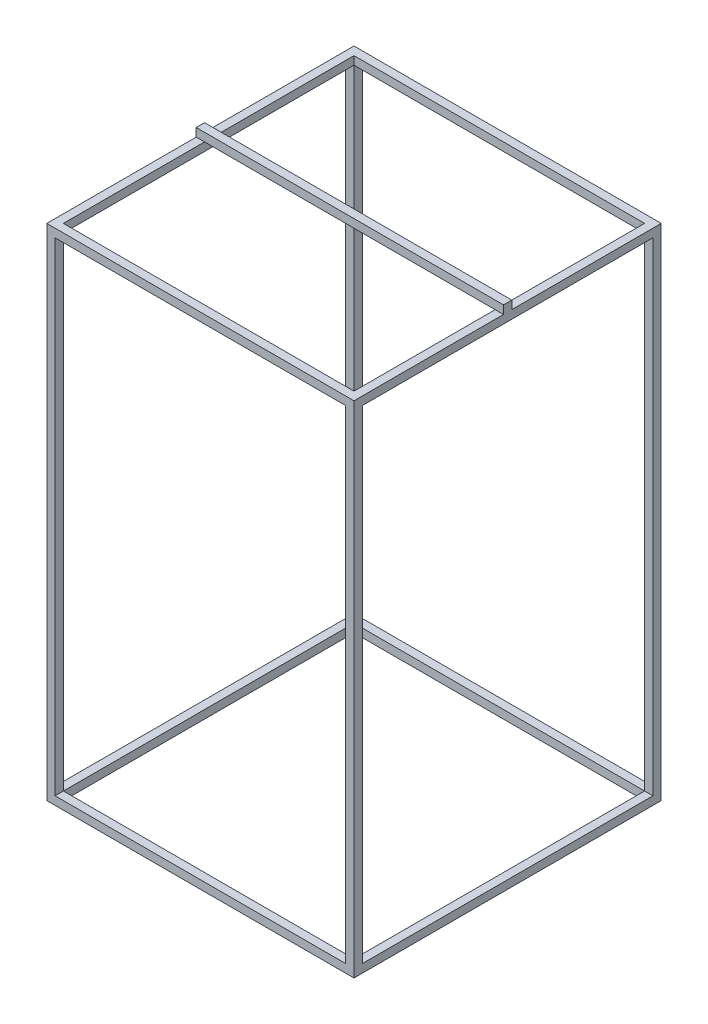
ISO-10303-21;
HEADER;
FILE_DESCRIPTION(('STEP AP214'),'2;1');
FILE_NAME('part.step','',(''),(''),'','','');
FILE_SCHEMA(('AUTOMOTIVE_DESIGN { 1 0 10303 214 1 1 1 1 }'));
ENDSEC;
DATA;
#1=APPLICATION_CONTEXT('core data for automotive mechanical design processes');
#2=APPLICATION_PROTOCOL_DEFINITION('international standard','automotive_design',2000,#1);
#3=PRODUCT_CONTEXT('',#1,'mechanical');
#4=PRODUCT('Part','Part','',(#3));
#5=PRODUCT_RELATED_PRODUCT_CATEGORY('part','',(#4));
#6=PRODUCT_DEFINITION_FORMATION('','',#4);
#7=PRODUCT_DEFINITION_CONTEXT('part definition',#1,'design');
#8=PRODUCT_DEFINITION('design','',#6,#7);
#9=PRODUCT_DEFINITION_SHAPE('','',#8);
#10=(LENGTH_UNIT() NAMED_UNIT(*) SI_UNIT(.MILLI.,.METRE.));
#11=(NAMED_UNIT(*) PLANE_ANGLE_UNIT() SI_UNIT($,.RADIAN.));
#12=(NAMED_UNIT(*) SI_UNIT($,.STERADIAN.) SOLID_ANGLE_UNIT());
#13=UNCERTAINTY_MEASURE_WITH_UNIT(LENGTH_MEASURE(1.E-05),#10,'distance_accuracy_value','');
#14=(GEOMETRIC_REPRESENTATION_CONTEXT(3) GLOBAL_UNCERTAINTY_ASSIGNED_CONTEXT((#13)) GLOBAL_UNIT_ASSIGNED_CONTEXT((#10,
#11,#12)) REPRESENTATION_CONTEXT('',''));
#15=CARTESIAN_POINT('',(0.,0.,0.));
#16=DIRECTION('',(0.,0.,1.));
#17=DIRECTION('',(1.,0.,0.));
#18=AXIS2_PLACEMENT_3D('',#15,#16,#17);
#19=CARTESIAN_POINT('',(0.,2479.675,0.));
#20=DIRECTION('',(0.,-1.,0.));
#21=DIRECTION('',(0.,0.,-1.));
#22=AXIS2_PLACEMENT_3D('',#19,#20,#21);
#23=PLANE('',#22);
#24=DIRECTION('',(1.,0.,0.));
#25=VECTOR('',#24,1.);
#26=CARTESIAN_POINT('',(0.,2479.675,20.6375));
#27=LINE('',#26,#25);
#28=CARTESIAN_POINT('',(-762.,2479.675,20.6375));
#29=VERTEX_POINT('',#28);
#30=CARTESIAN_POINT('',(-720.725,2479.675,20.6375));
#31=VERTEX_POINT('',#30);
#32=EDGE_CURVE('E275',#29,#31,#27,.T.);
#33=ORIENTED_EDGE('',*,*,#32,.F.);
#34=DIRECTION('',(0.,0.,1.));
#35=VECTOR('',#34,1.);
#36=CARTESIAN_POINT('',(-762.,2479.675,0.));
#37=LINE('',#36,#35);
#38=CARTESIAN_POINT('',(-762.,2479.675,762.));
#39=VERTEX_POINT('',#38);
#40=EDGE_CURVE('E542',#29,#39,#37,.T.);
#41=ORIENTED_EDGE('',*,*,#40,.T.);
#42=DIRECTION('',(-1.,0.,0.));
#43=VECTOR('',#42,1.);
#44=CARTESIAN_POINT('',(0.,2479.675,762.));
#45=LINE('',#44,#43);
#46=CARTESIAN_POINT('',(762.,2479.675,762.));
#47=VERTEX_POINT('',#46);
#48=EDGE_CURVE('E541',#47,#39,#45,.T.);
#49=ORIENTED_EDGE('',*,*,#48,.F.);
#50=DIRECTION('',(0.,0.,1.));
#51=VECTOR('',#50,1.);
#52=CARTESIAN_POINT('',(762.,2479.675,0.));
#53=LINE('',#52,#51);
#54=CARTESIAN_POINT('',(762.,2479.675,20.6375));
#55=VERTEX_POINT('',#54);
#56=EDGE_CURVE('E546',#55,#47,#53,.T.);
#57=ORIENTED_EDGE('',*,*,#56,.F.);
#58=CARTESIAN_POINT('',(720.725,2479.675,20.6375));
#59=VERTEX_POINT('',#58);
#60=EDGE_CURVE('E12',#59,#55,#27,.T.);
#61=ORIENTED_EDGE('',*,*,#60,.F.);
#62=DIRECTION('',(0.,0.,1.));
#63=VECTOR('',#62,1.);
#64=CARTESIAN_POINT('',(720.725,2479.675,0.));
#65=LINE('',#64,#63);
#66=CARTESIAN_POINT('',(720.725,2479.675,720.725));
#67=VERTEX_POINT('',#66);
#68=EDGE_CURVE('E500',#59,#67,#65,.T.);
#69=ORIENTED_EDGE('',*,*,#68,.T.);
#70=DIRECTION('',(-1.,0.,0.));
#71=VECTOR('',#70,1.);
#72=CARTESIAN_POINT('',(0.,2479.675,720.725));
#73=LINE('',#72,#71);
#74=CARTESIAN_POINT('',(-720.725,2479.675,720.725));
#75=VERTEX_POINT('',#74);
#76=EDGE_CURVE('E485',#67,#75,#73,.T.);
#77=ORIENTED_EDGE('',*,*,#76,.T.);
#78=DIRECTION('',(0.,0.,1.));
#79=VECTOR('',#78,1.);
#80=CARTESIAN_POINT('',(-720.725,2479.675,0.));
#81=LINE('',#80,#79);
#82=EDGE_CURVE('E489',#31,#75,#81,.T.);
#83=ORIENTED_EDGE('',*,*,#82,.F.);
#84=EDGE_LOOP('',(#33,#41,#49,#57,#61,#69,#77,#83));
#85=FACE_BOUND('',#84,.T.);
#86=ADVANCED_FACE('F263',(#85),#23,.F.);
#87=CARTESIAN_POINT('',(0.,41.275,0.));
#88=DIRECTION('',(0.,1.,0.));
#89=DIRECTION('',(0.,0.,1.));
#90=AXIS2_PLACEMENT_3D('',#87,#88,#89);
#91=PLANE('',#90);
#92=DIRECTION('',(-1.,0.,0.));
#93=VECTOR('',#92,1.);
#94=CARTESIAN_POINT('',(0.,41.275,720.725));
#95=LINE('',#94,#93);
#96=CARTESIAN_POINT('',(720.725,41.2750000000011,720.725));
#97=VERTEX_POINT('',#96);
#98=CARTESIAN_POINT('',(-720.725,41.2750000000011,720.725));
#99=VERTEX_POINT('',#98);
#100=EDGE_CURVE('E701',#97,#99,#95,.T.);
#101=ORIENTED_EDGE('',*,*,#100,.T.);
#102=DIRECTION('',(0.,0.,1.));
#103=VECTOR('',#102,1.);
#104=CARTESIAN_POINT('',(-720.725,41.275,0.));
#105=LINE('',#104,#103);
#106=CARTESIAN_POINT('',(-720.725,41.2750000000011,762.));
#107=VERTEX_POINT('',#106);
#108=EDGE_CURVE('E666',#99,#107,#105,.T.);
#109=ORIENTED_EDGE('',*,*,#108,.T.);
#110=DIRECTION('',(1.,0.,0.));
#111=VECTOR('',#110,1.);
#112=CARTESIAN_POINT('',(0.,41.275,762.));
#113=LINE('',#112,#111);
#114=CARTESIAN_POINT('',(720.725,41.2750000000011,762.));
#115=VERTEX_POINT('',#114);
#116=EDGE_CURVE('E710',#107,#115,#113,.T.);
#117=ORIENTED_EDGE('',*,*,#116,.T.);
#118=DIRECTION('',(0.,0.,1.));
#119=VECTOR('',#118,1.);
#120=CARTESIAN_POINT('',(720.725,41.275,0.));
#121=LINE('',#120,#119);
#122=EDGE_CURVE('E663',#97,#115,#121,.T.);
#123=ORIENTED_EDGE('',*,*,#122,.F.);
#124=EDGE_LOOP('',(#101,#109,#117,#123));
#125=FACE_BOUND('',#124,.T.);
#126=ADVANCED_FACE('F769',(#125),#91,.T.);
#127=DIRECTION('',(0.,0.,-1.));
#128=VECTOR('',#127,1.);
#129=CARTESIAN_POINT('',(720.725,41.275,0.));
#130=LINE('',#129,#128);
#131=CARTESIAN_POINT('',(720.725,41.275,-720.725));
#132=VERTEX_POINT('',#131);
#133=EDGE_CURVE('E684',#97,#132,#130,.T.);
#134=ORIENTED_EDGE('',*,*,#133,.F.);
#135=DIRECTION('',(1.,0.,0.));
#136=VECTOR('',#135,1.);
#137=CARTESIAN_POINT('',(0.,41.275,720.725));
#138=LINE('',#137,#136);
#139=CARTESIAN_POINT('',(762.,41.275,720.725));
#140=VERTEX_POINT('',#139);
#141=EDGE_CURVE('E645',#97,#140,#138,.T.);
#142=ORIENTED_EDGE('',*,*,#141,.T.);
#143=DIRECTION('',(0.,0.,-1.));
#144=VECTOR('',#143,1.);
#145=CARTESIAN_POINT('',(762.,41.275,0.));
#146=LINE('',#145,#144);
#147=CARTESIAN_POINT('',(762.,41.275,-720.725));
#148=VERTEX_POINT('',#147);
#149=EDGE_CURVE('E675',#140,#148,#146,.T.);
#150=ORIENTED_EDGE('',*,*,#149,.T.);
#151=DIRECTION('',(1.,0.,0.));
#152=VECTOR('',#151,1.);
#153=CARTESIAN_POINT('',(0.,41.275,-720.725));
#154=LINE('',#153,#152);
#155=EDGE_CURVE('E641',#132,#148,#154,.T.);
#156=ORIENTED_EDGE('',*,*,#155,.F.);
#157=EDGE_LOOP('',(#134,#142,#150,#156));
#158=FACE_BOUND('',#157,.T.);
#159=ADVANCED_FACE('F774',(#158),#91,.T.);
#160=DIRECTION('',(1.,0.,0.));
#161=VECTOR('',#160,1.);
#162=CARTESIAN_POINT('',(-720.725,41.275,-720.725));
#163=LINE('',#162,#161);
#164=CARTESIAN_POINT('',(-720.725,41.2750000000011,-720.725));
#165=VERTEX_POINT('',#164);
#166=EDGE_CURVE('E741',#165,#132,#163,.T.);
#167=ORIENTED_EDGE('',*,*,#166,.T.);
#168=DIRECTION('',(0.,0.,-1.));
#169=VECTOR('',#168,1.);
#170=CARTESIAN_POINT('',(720.725,41.275,0.));
#171=LINE('',#170,#169);
#172=CARTESIAN_POINT('',(720.725,41.275,-762.));
#173=VERTEX_POINT('',#172);
#174=EDGE_CURVE('E652',#132,#173,#171,.T.);
#175=ORIENTED_EDGE('',*,*,#174,.T.);
#176=DIRECTION('',(1.,0.,0.));
#177=VECTOR('',#176,1.);
#178=CARTESIAN_POINT('',(0.,41.275,-762.));
#179=LINE('',#178,#177);
#180=CARTESIAN_POINT('',(-720.725,41.2750000000011,-762.));
#181=VERTEX_POINT('',#180);
#182=EDGE_CURVE('E671',#181,#173,#179,.T.);
#183=ORIENTED_EDGE('',*,*,#182,.F.);
#184=DIRECTION('',(0.,0.,-1.));
#185=VECTOR('',#184,1.);
#186=CARTESIAN_POINT('',(-720.725,41.275,0.));
#187=LINE('',#186,#185);
#188=EDGE_CURVE('E649',#165,#181,#187,.T.);
#189=ORIENTED_EDGE('',*,*,#188,.F.);
#190=EDGE_LOOP('',(#167,#175,#183,#189));
#191=FACE_BOUND('',#190,.T.);
#192=ADVANCED_FACE('F784',(#191),#91,.T.);
#193=CARTESIAN_POINT('',(0.,0.,0.));
#194=DIRECTION('',(0.,1.,0.));
#195=DIRECTION('',(0.,0.,1.));
#196=AXIS2_PLACEMENT_3D('',#193,#194,#195);
#197=PLANE('',#196);
#198=DIRECTION('',(0.,0.,-1.));
#199=VECTOR('',#198,1.);
#200=CARTESIAN_POINT('',(762.,0.,0.));
#201=LINE('',#200,#199);
#202=CARTESIAN_POINT('',(762.,0.,762.));
#203=VERTEX_POINT('',#202);
#204=CARTESIAN_POINT('',(762.,0.,-762.));
#205=VERTEX_POINT('',#204);
#206=EDGE_CURVE('E676',#203,#205,#201,.T.);
#207=ORIENTED_EDGE('',*,*,#206,.F.);
#208=DIRECTION('',(1.,0.,0.));
#209=VECTOR('',#208,1.);
#210=CARTESIAN_POINT('',(0.,0.,762.));
#211=LINE('',#210,#209);
#212=CARTESIAN_POINT('',(-762.,0.,762.));
#213=VERTEX_POINT('',#212);
#214=EDGE_CURVE('E706',#213,#203,#211,.T.);
#215=ORIENTED_EDGE('',*,*,#214,.F.);
#216=DIRECTION('',(0.,0.,-1.));
#217=VECTOR('',#216,1.);
#218=CARTESIAN_POINT('',(-762.,0.,0.));
#219=LINE('',#218,#217);
#220=CARTESIAN_POINT('',(-762.,0.,-762.));
#221=VERTEX_POINT('',#220);
#222=EDGE_CURVE('E719',#213,#221,#219,.T.);
#223=ORIENTED_EDGE('',*,*,#222,.T.);
#224=DIRECTION('',(1.,0.,0.));
#225=VECTOR('',#224,1.);
#226=CARTESIAN_POINT('',(0.,0.,-762.));
#227=LINE('',#226,#225);
#228=EDGE_CURVE('E680',#221,#205,#227,.T.);
#229=ORIENTED_EDGE('',*,*,#228,.T.);
#230=EDGE_LOOP('',(#207,#215,#223,#229));
#231=FACE_BOUND('',#230,.T.);
#232=DIRECTION('',(0.,0.,-1.));
#233=VECTOR('',#232,1.);
#234=CARTESIAN_POINT('',(-720.725,0.,0.));
#235=LINE('',#234,#233);
#236=CARTESIAN_POINT('',(-720.725,0.,720.725));
#237=VERTEX_POINT('',#236);
#238=CARTESIAN_POINT('',(-720.725,0.,-720.725));
#239=VERTEX_POINT('',#238);
#240=EDGE_CURVE('E738',#237,#239,#235,.T.);
#241=ORIENTED_EDGE('',*,*,#240,.F.);
#242=DIRECTION('',(-1.,0.,0.));
#243=VECTOR('',#242,1.);
#244=CARTESIAN_POINT('',(0.,0.,720.725));
#245=LINE('',#244,#243);
#246=CARTESIAN_POINT('',(720.725,0.,720.725));
#247=VERTEX_POINT('',#246);
#248=EDGE_CURVE('E715',#247,#237,#245,.T.);
#249=ORIENTED_EDGE('',*,*,#248,.F.);
#250=DIRECTION('',(0.,0.,-1.));
#251=VECTOR('',#250,1.);
#252=CARTESIAN_POINT('',(720.725,0.,0.));
#253=LINE('',#252,#251);
#254=CARTESIAN_POINT('',(720.725,0.,-720.725));
#255=VERTEX_POINT('',#254);
#256=EDGE_CURVE('E697',#247,#255,#253,.T.);
#257=ORIENTED_EDGE('',*,*,#256,.T.);
#258=DIRECTION('',(1.,0.,0.));
#259=VECTOR('',#258,1.);
#260=CARTESIAN_POINT('',(-720.725,0.,-720.725));
#261=LINE('',#260,#259);
#262=EDGE_CURVE('E670',#239,#255,#261,.T.);
#263=ORIENTED_EDGE('',*,*,#262,.F.);
#264=EDGE_LOOP('',(#241,#249,#257,#263));
#265=FACE_BOUND('',#264,.T.);
#266=ADVANCED_FACE('F761',(#231,#265),#197,.F.);
#267=CARTESIAN_POINT('',(762.,41.275,0.));
#268=DIRECTION('',(-1.,0.,0.));
#269=DIRECTION('',(0.,0.,1.));
#270=AXIS2_PLACEMENT_3D('',#267,#268,#269);
#271=PLANE('',#270);
#272=DIRECTION('',(0.,-1.,0.));
#273=VECTOR('',#272,1.);
#274=CARTESIAN_POINT('',(762.,41.275,-762.));
#275=LINE('',#274,#273);
#276=CARTESIAN_POINT('',(762.,2479.675,-762.));
#277=VERTEX_POINT('',#276);
#278=EDGE_CURVE('E679',#277,#205,#275,.T.);
#279=ORIENTED_EDGE('',*,*,#278,.F.);
#280=CARTESIAN_POINT('',(762.,2479.675,-20.6375));
#281=VERTEX_POINT('',#280);
#282=EDGE_CURVE('E457',#277,#281,#53,.T.);
#283=ORIENTED_EDGE('',*,*,#282,.T.);
#284=DIRECTION('',(0.,-1.,0.));
#285=VECTOR('',#284,1.);
#286=CARTESIAN_POINT('',(762.,2520.95,-20.6375));
#287=LINE('',#286,#285);
#288=CARTESIAN_POINT('',(762.,2520.95,-20.6375));
#289=VERTEX_POINT('',#288);
#290=EDGE_CURVE('E283',#289,#281,#287,.T.);
#291=ORIENTED_EDGE('',*,*,#290,.F.);
#292=DIRECTION('',(0.,0.,-1.));
#293=VECTOR('',#292,1.);
#294=CARTESIAN_POINT('',(762.,2520.95,0.));
#295=LINE('',#294,#293);
#296=CARTESIAN_POINT('',(762.,2520.95,20.6375));
#297=VERTEX_POINT('',#296);
#298=EDGE_CURVE('E441',#297,#289,#295,.T.);
#299=ORIENTED_EDGE('',*,*,#298,.F.);
#300=DIRECTION('',(0.,-1.,0.));
#301=VECTOR('',#300,1.);
#302=CARTESIAN_POINT('',(762.,2520.95,20.6375));
#303=LINE('',#302,#301);
#304=EDGE_CURVE('E471',#297,#55,#303,.T.);
#305=ORIENTED_EDGE('',*,*,#304,.T.);
#306=ORIENTED_EDGE('',*,*,#56,.T.);
#307=DIRECTION('',(0.,-1.,0.));
#308=VECTOR('',#307,1.);
#309=CARTESIAN_POINT('',(762.,41.275,762.));
#310=LINE('',#309,#308);
#311=EDGE_CURVE('E714',#47,#203,#310,.T.);
#312=ORIENTED_EDGE('',*,*,#311,.T.);
#313=ORIENTED_EDGE('',*,*,#206,.T.);
#314=EDGE_LOOP('',(#279,#283,#291,#299,#305,#306,#312,#313));
#315=FACE_BOUND('',#314,.T.);
#316=DIRECTION('',(0.,0.,1.));
#317=VECTOR('',#316,1.);
#318=CARTESIAN_POINT('',(762.,2438.4,0.));
#319=LINE('',#318,#317);
#320=CARTESIAN_POINT('',(762.,2438.4,-720.725));
#321=VERTEX_POINT('',#320);
#322=CARTESIAN_POINT('',(762.,2438.4,720.725));
#323=VERTEX_POINT('',#322);
#324=EDGE_CURVE('E561',#321,#323,#319,.T.);
#325=ORIENTED_EDGE('',*,*,#324,.F.);
#326=DIRECTION('',(0.,-1.,0.));
#327=VECTOR('',#326,1.);
#328=CARTESIAN_POINT('',(762.,2438.4,-720.725));
#329=LINE('',#328,#327);
#330=EDGE_CURVE('E576',#321,#148,#329,.T.);
#331=ORIENTED_EDGE('',*,*,#330,.T.);
#332=ORIENTED_EDGE('',*,*,#149,.F.);
#333=DIRECTION('',(0.,-1.,0.));
#334=VECTOR('',#333,1.);
#335=CARTESIAN_POINT('',(762.,2438.4,720.725));
#336=LINE('',#335,#334);
#337=EDGE_CURVE('E602',#323,#140,#336,.T.);
#338=ORIENTED_EDGE('',*,*,#337,.F.);
#339=EDGE_LOOP('',(#325,#331,#332,#338));
#340=FACE_BOUND('',#339,.T.);
#341=ADVANCED_FACE('F454',(#315,#340),#271,.F.);
#342=CARTESIAN_POINT('',(0.,41.275,-762.));
#343=DIRECTION('',(0.,0.,-1.));
#344=DIRECTION('',(-1.,0.,0.));
#345=AXIS2_PLACEMENT_3D('',#342,#343,#344);
#346=PLANE('',#345);
#347=DIRECTION('',(-1.,0.,0.));
#348=VECTOR('',#347,1.);
#349=CARTESIAN_POINT('',(0.,2438.4,-762.));
#350=LINE('',#349,#348);
#351=CARTESIAN_POINT('',(720.725,2438.4,-762.));
#352=VERTEX_POINT('',#351);
#353=CARTESIAN_POINT('',(-720.725,2438.4,-762.));
#354=VERTEX_POINT('',#353);
#355=EDGE_CURVE('E565',#352,#354,#350,.T.);
#356=ORIENTED_EDGE('',*,*,#355,.T.);
#357=DIRECTION('',(0.,-1.,0.));
#358=VECTOR('',#357,1.);
#359=CARTESIAN_POINT('',(-720.725,2438.4,-762.));
#360=LINE('',#359,#358);
#361=EDGE_CURVE('E637',#354,#181,#360,.T.);
#362=ORIENTED_EDGE('',*,*,#361,.T.);
#363=ORIENTED_EDGE('',*,*,#182,.T.);
#364=DIRECTION('',(0.,-1.,0.));
#365=VECTOR('',#364,1.);
#366=CARTESIAN_POINT('',(720.725,2438.4,-762.));
#367=LINE('',#366,#365);
#368=EDGE_CURVE('E584',#352,#173,#367,.T.);
#369=ORIENTED_EDGE('',*,*,#368,.F.);
#370=EDGE_LOOP('',(#356,#362,#363,#369));
#371=FACE_BOUND('',#370,.T.);
#372=ORIENTED_EDGE('',*,*,#278,.T.);
#373=ORIENTED_EDGE('',*,*,#228,.F.);
#374=DIRECTION('',(0.,-1.,0.));
#375=VECTOR('',#374,1.);
#376=CARTESIAN_POINT('',(-762.,41.275,-762.));
#377=LINE('',#376,#375);
#378=CARTESIAN_POINT('',(-762.,2479.675,-762.));
#379=VERTEX_POINT('',#378);
#380=EDGE_CURVE('E267',#379,#221,#377,.T.);
#381=ORIENTED_EDGE('',*,*,#380,.F.);
#382=DIRECTION('',(-1.,0.,0.));
#383=VECTOR('',#382,1.);
#384=CARTESIAN_POINT('',(0.,2479.675,-762.));
#385=LINE('',#384,#383);
#386=EDGE_CURVE('E549',#277,#379,#385,.T.);
#387=ORIENTED_EDGE('',*,*,#386,.F.);
#388=EDGE_LOOP('',(#372,#373,#381,#387));
#389=FACE_BOUND('',#388,.T.);
#390=ADVANCED_FACE('F844',(#371,#389),#346,.T.);
#391=DIRECTION('',(-1.,0.,0.));
#392=VECTOR('',#391,1.);
#393=CARTESIAN_POINT('',(0.,41.275,720.725));
#394=LINE('',#393,#392);
#395=CARTESIAN_POINT('',(-762.,41.275,720.725));
#396=VERTEX_POINT('',#395);
#397=EDGE_CURVE('E659',#99,#396,#394,.T.);
#398=ORIENTED_EDGE('',*,*,#397,.F.);
#399=DIRECTION('',(0.,0.,-1.));
#400=VECTOR('',#399,1.);
#401=CARTESIAN_POINT('',(-720.725,41.275,0.));
#402=LINE('',#401,#400);
#403=EDGE_CURVE('E720',#99,#165,#402,.T.);
#404=ORIENTED_EDGE('',*,*,#403,.T.);
#405=DIRECTION('',(-1.,0.,0.));
#406=VECTOR('',#405,1.);
#407=CARTESIAN_POINT('',(0.,41.275,-720.725));
#408=LINE('',#407,#406);
#409=CARTESIAN_POINT('',(-762.,41.275,-720.725));
#410=VERTEX_POINT('',#409);
#411=EDGE_CURVE('E655',#165,#410,#408,.T.);
#412=ORIENTED_EDGE('',*,*,#411,.T.);
#413=DIRECTION('',(0.,0.,-1.));
#414=VECTOR('',#413,1.);
#415=CARTESIAN_POINT('',(-762.,41.275,0.));
#416=LINE('',#415,#414);
#417=EDGE_CURVE('E705',#396,#410,#416,.T.);
#418=ORIENTED_EDGE('',*,*,#417,.F.);
#419=EDGE_LOOP('',(#398,#404,#412,#418));
#420=FACE_BOUND('',#419,.T.);
#421=ADVANCED_FACE('F850',(#420),#91,.T.);
#422=CARTESIAN_POINT('',(0.,41.275,762.));
#423=DIRECTION('',(0.,0.,-1.));
#424=DIRECTION('',(-1.,0.,0.));
#425=AXIS2_PLACEMENT_3D('',#422,#423,#424);
#426=PLANE('',#425);
#427=ORIENTED_EDGE('',*,*,#311,.F.);
#428=ORIENTED_EDGE('',*,*,#48,.T.);
#429=DIRECTION('',(0.,-1.,0.));
#430=VECTOR('',#429,1.);
#431=CARTESIAN_POINT('',(-762.,41.275,762.));
#432=LINE('',#431,#430);
#433=EDGE_CURVE('E728',#39,#213,#432,.T.);
#434=ORIENTED_EDGE('',*,*,#433,.T.);
#435=ORIENTED_EDGE('',*,*,#214,.T.);
#436=EDGE_LOOP('',(#427,#428,#434,#435));
#437=FACE_BOUND('',#436,.T.);
#438=DIRECTION('',(-1.,0.,0.));
#439=VECTOR('',#438,1.);
#440=CARTESIAN_POINT('',(0.,2438.4,762.));
#441=LINE('',#440,#439);
#442=CARTESIAN_POINT('',(720.725,2438.4,762.));
#443=VERTEX_POINT('',#442);
#444=CARTESIAN_POINT('',(-720.725,2438.4,762.));
#445=VERTEX_POINT('',#444);
#446=EDGE_CURVE('E557',#443,#445,#441,.T.);
#447=ORIENTED_EDGE('',*,*,#446,.F.);
#448=DIRECTION('',(0.,-1.,0.));
#449=VECTOR('',#448,1.);
#450=CARTESIAN_POINT('',(720.725,2438.4,762.));
#451=LINE('',#450,#449);
#452=EDGE_CURVE('E572',#443,#115,#451,.T.);
#453=ORIENTED_EDGE('',*,*,#452,.T.);
#454=ORIENTED_EDGE('',*,*,#116,.F.);
#455=DIRECTION('',(0.,-1.,0.));
#456=VECTOR('',#455,1.);
#457=CARTESIAN_POINT('',(-720.725,2438.4,762.));
#458=LINE('',#457,#456);
#459=EDGE_CURVE('E594',#445,#107,#458,.T.);
#460=ORIENTED_EDGE('',*,*,#459,.F.);
#461=EDGE_LOOP('',(#447,#453,#454,#460));
#462=FACE_BOUND('',#461,.T.);
#463=ADVANCED_FACE('F860',(#437,#462),#426,.F.);
#464=CARTESIAN_POINT('',(0.,41.275,720.725));
#465=DIRECTION('',(0.,0.,1.));
#466=DIRECTION('',(1.,0.,0.));
#467=AXIS2_PLACEMENT_3D('',#464,#465,#466);
#468=PLANE('',#467);
#469=ORIENTED_EDGE('',*,*,#100,.F.);
#470=DIRECTION('',(0.,-1.,0.));
#471=VECTOR('',#470,1.);
#472=CARTESIAN_POINT('',(720.725,41.275,720.725));
#473=LINE('',#472,#471);
#474=EDGE_CURVE('E700',#97,#247,#473,.T.);
#475=ORIENTED_EDGE('',*,*,#474,.T.);
#476=ORIENTED_EDGE('',*,*,#248,.T.);
#477=DIRECTION('',(0.,-1.,0.));
#478=VECTOR('',#477,1.);
#479=CARTESIAN_POINT('',(-720.725,41.275,720.725));
#480=LINE('',#479,#478);
#481=EDGE_CURVE('E731',#99,#237,#480,.T.);
#482=ORIENTED_EDGE('',*,*,#481,.F.);
#483=EDGE_LOOP('',(#469,#475,#476,#482));
#484=FACE_BOUND('',#483,.T.);
#485=ADVANCED_FACE('F757',(#484),#468,.F.);
#486=CARTESIAN_POINT('',(-762.,41.275,762.));
#487=DIRECTION('',(-1.,0.,0.));
#488=DIRECTION('',(0.,0.,1.));
#489=AXIS2_PLACEMENT_3D('',#486,#487,#488);
#490=PLANE('',#489);
#491=CARTESIAN_POINT('',(-762.,2479.675,-20.6375));
#492=VERTEX_POINT('',#491);
#493=EDGE_CURVE('E537',#379,#492,#37,.T.);
#494=ORIENTED_EDGE('',*,*,#493,.F.);
#495=ORIENTED_EDGE('',*,*,#380,.T.);
#496=ORIENTED_EDGE('',*,*,#222,.F.);
#497=ORIENTED_EDGE('',*,*,#433,.F.);
#498=ORIENTED_EDGE('',*,*,#40,.F.);
#499=DIRECTION('',(0.,-1.,0.));
#500=VECTOR('',#499,1.);
#501=CARTESIAN_POINT('',(-762.,2520.95,20.6375));
#502=LINE('',#501,#500);
#503=CARTESIAN_POINT('',(-762.,2520.95,20.6375));
#504=VERTEX_POINT('',#503);
#505=EDGE_CURVE('E480',#504,#29,#502,.T.);
#506=ORIENTED_EDGE('',*,*,#505,.F.);
#507=DIRECTION('',(0.,0.,-1.));
#508=VECTOR('',#507,1.);
#509=CARTESIAN_POINT('',(-762.,2520.95,0.));
#510=LINE('',#509,#508);
#511=CARTESIAN_POINT('',(-762.,2520.95,-20.6375));
#512=VERTEX_POINT('',#511);
#513=EDGE_CURVE('E464',#504,#512,#510,.T.);
#514=ORIENTED_EDGE('',*,*,#513,.T.);
#515=DIRECTION('',(0.,-1.,0.));
#516=VECTOR('',#515,1.);
#517=CARTESIAN_POINT('',(-762.,2520.95,-20.6375));
#518=LINE('',#517,#516);
#519=EDGE_CURVE('E460',#512,#492,#518,.T.);
#520=ORIENTED_EDGE('',*,*,#519,.T.);
#521=EDGE_LOOP('',(#494,#495,#496,#497,#498,#506,#514,#520));
#522=FACE_BOUND('',#521,.T.);
#523=DIRECTION('',(0.,-1.,0.));
#524=VECTOR('',#523,1.);
#525=CARTESIAN_POINT('',(-762.,2438.4,-720.725));
#526=LINE('',#525,#524);
#527=CARTESIAN_POINT('',(-762.,2438.4,-720.725));
#528=VERTEX_POINT('',#527);
#529=EDGE_CURVE('E634',#528,#410,#526,.T.);
#530=ORIENTED_EDGE('',*,*,#529,.F.);
#531=DIRECTION('',(0.,0.,1.));
#532=VECTOR('',#531,1.);
#533=CARTESIAN_POINT('',(-762.,2438.4,0.));
#534=LINE('',#533,#532);
#535=CARTESIAN_POINT('',(-762.,2438.4,720.725));
#536=VERTEX_POINT('',#535);
#537=EDGE_CURVE('E525',#528,#536,#534,.T.);
#538=ORIENTED_EDGE('',*,*,#537,.T.);
#539=DIRECTION('',(0.,-1.,0.));
#540=VECTOR('',#539,1.);
#541=CARTESIAN_POINT('',(-762.,2438.4,720.725));
#542=LINE('',#541,#540);
#543=EDGE_CURVE('E615',#536,#396,#542,.T.);
#544=ORIENTED_EDGE('',*,*,#543,.T.);
#545=ORIENTED_EDGE('',*,*,#417,.T.);
#546=EDGE_LOOP('',(#530,#538,#544,#545));
#547=FACE_BOUND('',#546,.T.);
#548=ADVANCED_FACE('F265',(#522,#547),#490,.T.);
#549=CARTESIAN_POINT('',(-720.725,41.275,720.725));
#550=DIRECTION('',(-1.,0.,0.));
#551=DIRECTION('',(0.,0.,1.));
#552=AXIS2_PLACEMENT_3D('',#549,#550,#551);
#553=PLANE('',#552);
#554=ORIENTED_EDGE('',*,*,#481,.T.);
#555=ORIENTED_EDGE('',*,*,#240,.T.);
#556=DIRECTION('',(0.,-1.,0.));
#557=VECTOR('',#556,1.);
#558=CARTESIAN_POINT('',(-720.725,41.275,-720.725));
#559=LINE('',#558,#557);
#560=EDGE_CURVE('E745',#165,#239,#559,.T.);
#561=ORIENTED_EDGE('',*,*,#560,.F.);
#562=ORIENTED_EDGE('',*,*,#403,.F.);
#563=EDGE_LOOP('',(#554,#555,#561,#562));
#564=FACE_BOUND('',#563,.T.);
#565=ADVANCED_FACE('F766',(#564),#553,.F.);
#566=CARTESIAN_POINT('',(-720.725,41.275,-720.725));
#567=DIRECTION('',(0.,0.,-1.));
#568=DIRECTION('',(-1.,0.,0.));
#569=AXIS2_PLACEMENT_3D('',#566,#567,#568);
#570=PLANE('',#569);
#571=ORIENTED_EDGE('',*,*,#262,.T.);
#572=DIRECTION('',(0.,-1.,0.));
#573=VECTOR('',#572,1.);
#574=CARTESIAN_POINT('',(720.725,41.275,-720.725));
#575=LINE('',#574,#573);
#576=EDGE_CURVE('E690',#132,#255,#575,.T.);
#577=ORIENTED_EDGE('',*,*,#576,.F.);
#578=ORIENTED_EDGE('',*,*,#166,.F.);
#579=ORIENTED_EDGE('',*,*,#560,.T.);
#580=EDGE_LOOP('',(#571,#577,#578,#579));
#581=FACE_BOUND('',#580,.T.);
#582=ADVANCED_FACE('F780',(#581),#570,.F.);
#583=CARTESIAN_POINT('',(720.725,41.275,0.));
#584=DIRECTION('',(-1.,0.,0.));
#585=DIRECTION('',(0.,0.,1.));
#586=AXIS2_PLACEMENT_3D('',#583,#584,#585);
#587=PLANE('',#586);
#588=ORIENTED_EDGE('',*,*,#256,.F.);
#589=ORIENTED_EDGE('',*,*,#474,.F.);
#590=ORIENTED_EDGE('',*,*,#133,.T.);
#591=ORIENTED_EDGE('',*,*,#576,.T.);
#592=EDGE_LOOP('',(#588,#589,#590,#591));
#593=FACE_BOUND('',#592,.T.);
#594=ADVANCED_FACE('F777',(#593),#587,.T.);
#595=CARTESIAN_POINT('',(-720.725,2438.4,0.));
#596=DIRECTION('',(1.,0.,0.));
#597=DIRECTION('',(0.,0.,-1.));
#598=AXIS2_PLACEMENT_3D('',#595,#596,#597);
#599=PLANE('',#598);
#600=DIRECTION('',(0.,-1.,0.));
#601=VECTOR('',#600,1.);
#602=CARTESIAN_POINT('',(-720.725,2438.4,-720.725));
#603=LINE('',#602,#601);
#604=CARTESIAN_POINT('',(-720.725,2438.4,-720.725));
#605=VERTEX_POINT('',#604);
#606=EDGE_CURVE('E630',#605,#165,#603,.T.);
#607=ORIENTED_EDGE('',*,*,#606,.T.);
#608=ORIENTED_EDGE('',*,*,#188,.T.);
#609=ORIENTED_EDGE('',*,*,#361,.F.);
#610=DIRECTION('',(0.,0.,1.));
#611=VECTOR('',#610,1.);
#612=CARTESIAN_POINT('',(-720.725,2438.4,0.));
#613=LINE('',#612,#611);
#614=EDGE_CURVE('E588',#354,#605,#613,.T.);
#615=ORIENTED_EDGE('',*,*,#614,.T.);
#616=EDGE_LOOP('',(#607,#608,#609,#615));
#617=FACE_BOUND('',#616,.T.);
#618=ADVANCED_FACE('F847',(#617),#599,.T.);
#619=CARTESIAN_POINT('',(0.,2438.4,-720.725));
#620=DIRECTION('',(0.,0.,-1.));
#621=DIRECTION('',(-1.,0.,0.));
#622=AXIS2_PLACEMENT_3D('',#619,#620,#621);
#623=PLANE('',#622);
#624=ORIENTED_EDGE('',*,*,#411,.F.);
#625=ORIENTED_EDGE('',*,*,#606,.F.);
#626=DIRECTION('',(1.,0.,0.));
#627=VECTOR('',#626,1.);
#628=CARTESIAN_POINT('',(0.,2438.4,-720.725));
#629=LINE('',#628,#627);
#630=EDGE_CURVE('E627',#528,#605,#629,.T.);
#631=ORIENTED_EDGE('',*,*,#630,.F.);
#632=ORIENTED_EDGE('',*,*,#529,.T.);
#633=EDGE_LOOP('',(#624,#625,#631,#632));
#634=FACE_BOUND('',#633,.T.);
#635=ADVANCED_FACE('F832',(#634),#623,.F.);
#636=CARTESIAN_POINT('',(720.725,2438.4,0.));
#637=DIRECTION('',(1.,0.,0.));
#638=DIRECTION('',(0.,0.,-1.));
#639=AXIS2_PLACEMENT_3D('',#636,#637,#638);
#640=PLANE('',#639);
#641=ORIENTED_EDGE('',*,*,#174,.F.);
#642=DIRECTION('',(0.,-1.,0.));
#643=VECTOR('',#642,1.);
#644=CARTESIAN_POINT('',(720.725,2438.4,-720.725));
#645=LINE('',#644,#643);
#646=CARTESIAN_POINT('',(720.725,2438.4,-720.725));
#647=VERTEX_POINT('',#646);
#648=EDGE_CURVE('E580',#647,#132,#645,.T.);
#649=ORIENTED_EDGE('',*,*,#648,.F.);
#650=DIRECTION('',(0.,0.,1.));
#651=VECTOR('',#650,1.);
#652=CARTESIAN_POINT('',(720.725,2438.4,0.));
#653=LINE('',#652,#651);
#654=EDGE_CURVE('E568',#352,#647,#653,.T.);
#655=ORIENTED_EDGE('',*,*,#654,.F.);
#656=ORIENTED_EDGE('',*,*,#368,.T.);
#657=EDGE_LOOP('',(#641,#649,#655,#656));
#658=FACE_BOUND('',#657,.T.);
#659=ADVANCED_FACE('F788',(#658),#640,.F.);
#660=CARTESIAN_POINT('',(0.,2438.4,-720.725));
#661=DIRECTION('',(0.,0.,1.));
#662=DIRECTION('',(1.,0.,0.));
#663=AXIS2_PLACEMENT_3D('',#660,#661,#662);
#664=PLANE('',#663);
#665=ORIENTED_EDGE('',*,*,#648,.T.);
#666=ORIENTED_EDGE('',*,*,#155,.T.);
#667=ORIENTED_EDGE('',*,*,#330,.F.);
#668=DIRECTION('',(-1.,0.,0.));
#669=VECTOR('',#668,1.);
#670=CARTESIAN_POINT('',(0.,2438.4,-720.725));
#671=LINE('',#670,#669);
#672=EDGE_CURVE('E571',#321,#647,#671,.T.);
#673=ORIENTED_EDGE('',*,*,#672,.T.);
#674=EDGE_LOOP('',(#665,#666,#667,#673));
#675=FACE_BOUND('',#674,.T.);
#676=ADVANCED_FACE('F792',(#675),#664,.T.);
#677=CARTESIAN_POINT('',(720.725,2438.4,0.));
#678=DIRECTION('',(-1.,0.,0.));
#679=DIRECTION('',(0.,0.,1.));
#680=AXIS2_PLACEMENT_3D('',#677,#678,#679);
#681=PLANE('',#680);
#682=DIRECTION('',(0.,-1.,0.));
#683=VECTOR('',#682,1.);
#684=CARTESIAN_POINT('',(720.725,2438.4,720.725));
#685=LINE('',#684,#683);
#686=CARTESIAN_POINT('',(720.725,2438.4,720.725));
#687=VERTEX_POINT('',#686);
#688=EDGE_CURVE('E598',#687,#97,#685,.T.);
#689=ORIENTED_EDGE('',*,*,#688,.T.);
#690=ORIENTED_EDGE('',*,*,#122,.T.);
#691=ORIENTED_EDGE('',*,*,#452,.F.);
#692=DIRECTION('',(0.,0.,-1.));
#693=VECTOR('',#692,1.);
#694=CARTESIAN_POINT('',(720.725,2438.4,0.));
#695=LINE('',#694,#693);
#696=EDGE_CURVE('E589',#443,#687,#695,.T.);
#697=ORIENTED_EDGE('',*,*,#696,.T.);
#698=EDGE_LOOP('',(#689,#690,#691,#697));
#699=FACE_BOUND('',#698,.T.);
#700=ADVANCED_FACE('F1073',(#699),#681,.T.);
#701=CARTESIAN_POINT('',(0.,2438.4,720.725));
#702=DIRECTION('',(0.,0.,1.));
#703=DIRECTION('',(1.,0.,0.));
#704=AXIS2_PLACEMENT_3D('',#701,#702,#703);
#705=PLANE('',#704);
#706=ORIENTED_EDGE('',*,*,#141,.F.);
#707=ORIENTED_EDGE('',*,*,#688,.F.);
#708=DIRECTION('',(-1.,0.,0.));
#709=VECTOR('',#708,1.);
#710=CARTESIAN_POINT('',(0.,2438.4,720.725));
#711=LINE('',#710,#709);
#712=EDGE_CURVE('E593',#323,#687,#711,.T.);
#713=ORIENTED_EDGE('',*,*,#712,.F.);
#714=ORIENTED_EDGE('',*,*,#337,.T.);
#715=EDGE_LOOP('',(#706,#707,#713,#714));
#716=FACE_BOUND('',#715,.T.);
#717=ADVANCED_FACE('F800',(#716),#705,.F.);
#718=CARTESIAN_POINT('',(-720.725,2438.4,0.));
#719=DIRECTION('',(-1.,0.,0.));
#720=DIRECTION('',(0.,0.,1.));
#721=AXIS2_PLACEMENT_3D('',#718,#719,#720);
#722=PLANE('',#721);
#723=ORIENTED_EDGE('',*,*,#108,.F.);
#724=DIRECTION('',(0.,-1.,0.));
#725=VECTOR('',#724,1.);
#726=CARTESIAN_POINT('',(-720.725,2438.4,720.725));
#727=LINE('',#726,#725);
#728=CARTESIAN_POINT('',(-720.725,2438.4,720.725));
#729=VERTEX_POINT('',#728);
#730=EDGE_CURVE('E618',#729,#99,#727,.T.);
#731=ORIENTED_EDGE('',*,*,#730,.F.);
#732=DIRECTION('',(0.,0.,-1.));
#733=VECTOR('',#732,1.);
#734=CARTESIAN_POINT('',(-720.725,2438.4,0.));
#735=LINE('',#734,#733);
#736=EDGE_CURVE('E553',#445,#729,#735,.T.);
#737=ORIENTED_EDGE('',*,*,#736,.F.);
#738=ORIENTED_EDGE('',*,*,#459,.T.);
#739=EDGE_LOOP('',(#723,#731,#737,#738));
#740=FACE_BOUND('',#739,.T.);
#741=ADVANCED_FACE('F818',(#740),#722,.F.);
#742=CARTESIAN_POINT('',(0.,2438.4,720.725));
#743=DIRECTION('',(0.,0.,-1.));
#744=DIRECTION('',(-1.,0.,0.));
#745=AXIS2_PLACEMENT_3D('',#742,#743,#744);
#746=PLANE('',#745);
#747=ORIENTED_EDGE('',*,*,#730,.T.);
#748=ORIENTED_EDGE('',*,*,#397,.T.);
#749=ORIENTED_EDGE('',*,*,#543,.F.);
#750=DIRECTION('',(1.,0.,0.));
#751=VECTOR('',#750,1.);
#752=CARTESIAN_POINT('',(0.,2438.4,720.725));
#753=LINE('',#752,#751);
#754=EDGE_CURVE('E611',#536,#729,#753,.T.);
#755=ORIENTED_EDGE('',*,*,#754,.T.);
#756=EDGE_LOOP('',(#747,#748,#749,#755));
#757=FACE_BOUND('',#756,.T.);
#758=ADVANCED_FACE('F822',(#757),#746,.T.);
#759=CARTESIAN_POINT('',(0.,2438.4,0.));
#760=DIRECTION('',(0.,-1.,0.));
#761=DIRECTION('',(0.,0.,-1.));
#762=AXIS2_PLACEMENT_3D('',#759,#760,#761);
#763=PLANE('',#762);
#764=ORIENTED_EDGE('',*,*,#630,.T.);
#765=DIRECTION('',(0.,0.,1.));
#766=VECTOR('',#765,1.);
#767=CARTESIAN_POINT('',(-720.725,2438.4,0.));
#768=LINE('',#767,#766);
#769=EDGE_CURVE('E510',#605,#729,#768,.T.);
#770=ORIENTED_EDGE('',*,*,#769,.T.);
#771=ORIENTED_EDGE('',*,*,#754,.F.);
#772=ORIENTED_EDGE('',*,*,#537,.F.);
#773=EDGE_LOOP('',(#764,#770,#771,#772));
#774=FACE_BOUND('',#773,.T.);
#775=ADVANCED_FACE('F824',(#774),#763,.T.);
#776=DIRECTION('',(-1.,0.,0.));
#777=VECTOR('',#776,1.);
#778=CARTESIAN_POINT('',(0.,2438.4,-720.725));
#779=LINE('',#778,#777);
#780=EDGE_CURVE('E514',#647,#605,#779,.T.);
#781=ORIENTED_EDGE('',*,*,#780,.T.);
#782=ORIENTED_EDGE('',*,*,#614,.F.);
#783=ORIENTED_EDGE('',*,*,#355,.F.);
#784=ORIENTED_EDGE('',*,*,#654,.T.);
#785=EDGE_LOOP('',(#781,#782,#783,#784));
#786=FACE_BOUND('',#785,.T.);
#787=ADVANCED_FACE('F841',(#786),#763,.T.);
#788=DIRECTION('',(0.,0.,1.));
#789=VECTOR('',#788,1.);
#790=CARTESIAN_POINT('',(720.725,2438.4,0.));
#791=LINE('',#790,#789);
#792=EDGE_CURVE('E490',#647,#687,#791,.T.);
#793=ORIENTED_EDGE('',*,*,#792,.F.);
#794=ORIENTED_EDGE('',*,*,#672,.F.);
#795=ORIENTED_EDGE('',*,*,#324,.T.);
#796=ORIENTED_EDGE('',*,*,#712,.T.);
#797=EDGE_LOOP('',(#793,#794,#795,#796));
#798=FACE_BOUND('',#797,.T.);
#799=ADVANCED_FACE('F797',(#798),#763,.T.);
#800=DIRECTION('',(-1.,0.,0.));
#801=VECTOR('',#800,1.);
#802=CARTESIAN_POINT('',(0.,2438.4,720.725));
#803=LINE('',#802,#801);
#804=EDGE_CURVE('E459',#687,#729,#803,.T.);
#805=ORIENTED_EDGE('',*,*,#804,.F.);
#806=ORIENTED_EDGE('',*,*,#696,.F.);
#807=ORIENTED_EDGE('',*,*,#446,.T.);
#808=ORIENTED_EDGE('',*,*,#736,.T.);
#809=EDGE_LOOP('',(#805,#806,#807,#808));
#810=FACE_BOUND('',#809,.T.);
#811=ADVANCED_FACE('F814',(#810),#763,.T.);
#812=ORIENTED_EDGE('',*,*,#493,.T.);
#813=DIRECTION('',(1.,0.,0.));
#814=VECTOR('',#813,1.);
#815=CARTESIAN_POINT('',(0.,2479.675,-20.6375));
#816=LINE('',#815,#814);
#817=CARTESIAN_POINT('',(-720.725,2479.675,-20.6375));
#818=VERTEX_POINT('',#817);
#819=EDGE_CURVE('E472',#492,#818,#816,.T.);
#820=ORIENTED_EDGE('',*,*,#819,.T.);
#821=CARTESIAN_POINT('',(-720.725,2479.675,-720.725));
#822=VERTEX_POINT('',#821);
#823=EDGE_CURVE('E491',#822,#818,#81,.T.);
#824=ORIENTED_EDGE('',*,*,#823,.F.);
#825=DIRECTION('',(-1.,0.,0.));
#826=VECTOR('',#825,1.);
#827=CARTESIAN_POINT('',(0.,2479.675,-720.725));
#828=LINE('',#827,#826);
#829=CARTESIAN_POINT('',(720.725,2479.675,-720.725));
#830=VERTEX_POINT('',#829);
#831=EDGE_CURVE('E495',#830,#822,#828,.T.);
#832=ORIENTED_EDGE('',*,*,#831,.F.);
#833=CARTESIAN_POINT('',(720.725,2479.675,-20.6375));
#834=VERTEX_POINT('',#833);
#835=EDGE_CURVE('E501',#830,#834,#65,.T.);
#836=ORIENTED_EDGE('',*,*,#835,.T.);
#837=EDGE_CURVE('E273',#834,#281,#816,.T.);
#838=ORIENTED_EDGE('',*,*,#837,.T.);
#839=ORIENTED_EDGE('',*,*,#282,.F.);
#840=ORIENTED_EDGE('',*,*,#386,.T.);
#841=EDGE_LOOP('',(#812,#820,#824,#832,#836,#838,#839,#840));
#842=FACE_BOUND('',#841,.T.);
#843=ADVANCED_FACE('F866',(#842),#23,.F.);
#844=CARTESIAN_POINT('',(0.,2479.675,720.725));
#845=DIRECTION('',(0.,0.,1.));
#846=DIRECTION('',(1.,0.,0.));
#847=AXIS2_PLACEMENT_3D('',#844,#845,#846);
#848=PLANE('',#847);
#849=ORIENTED_EDGE('',*,*,#804,.T.);
#850=DIRECTION('',(0.,-1.,0.));
#851=VECTOR('',#850,1.);
#852=CARTESIAN_POINT('',(-720.725,2479.675,720.725));
#853=LINE('',#852,#851);
#854=EDGE_CURVE('E505',#75,#729,#853,.T.);
#855=ORIENTED_EDGE('',*,*,#854,.F.);
#856=ORIENTED_EDGE('',*,*,#76,.F.);
#857=DIRECTION('',(0.,-1.,0.));
#858=VECTOR('',#857,1.);
#859=CARTESIAN_POINT('',(720.725,2479.675,720.725));
#860=LINE('',#859,#858);
#861=EDGE_CURVE('E521',#67,#687,#860,.T.);
#862=ORIENTED_EDGE('',*,*,#861,.T.);
#863=EDGE_LOOP('',(#849,#855,#856,#862));
#864=FACE_BOUND('',#863,.T.);
#865=ADVANCED_FACE('F804',(#864),#848,.F.);
#866=CARTESIAN_POINT('',(720.725,2479.675,0.));
#867=DIRECTION('',(1.,0.,0.));
#868=DIRECTION('',(0.,0.,-1.));
#869=AXIS2_PLACEMENT_3D('',#866,#867,#868);
#870=PLANE('',#869);
#871=ORIENTED_EDGE('',*,*,#792,.T.);
#872=ORIENTED_EDGE('',*,*,#861,.F.);
#873=ORIENTED_EDGE('',*,*,#68,.F.);
#874=EDGE_CURVE('E506',#834,#59,#65,.T.);
#875=ORIENTED_EDGE('',*,*,#874,.F.);
#876=ORIENTED_EDGE('',*,*,#835,.F.);
#877=DIRECTION('',(0.,-1.,0.));
#878=VECTOR('',#877,1.);
#879=CARTESIAN_POINT('',(720.725,2479.675,-720.725));
#880=LINE('',#879,#878);
#881=EDGE_CURVE('E526',#830,#647,#880,.T.);
#882=ORIENTED_EDGE('',*,*,#881,.T.);
#883=EDGE_LOOP('',(#871,#872,#873,#875,#876,#882));
#884=FACE_BOUND('',#883,.T.);
#885=ADVANCED_FACE('F809',(#884),#870,.F.);
#886=CARTESIAN_POINT('',(0.,2479.675,-720.725));
#887=DIRECTION('',(0.,0.,1.));
#888=DIRECTION('',(1.,0.,0.));
#889=AXIS2_PLACEMENT_3D('',#886,#887,#888);
#890=PLANE('',#889);
#891=ORIENTED_EDGE('',*,*,#780,.F.);
#892=ORIENTED_EDGE('',*,*,#881,.F.);
#893=ORIENTED_EDGE('',*,*,#831,.T.);
#894=DIRECTION('',(0.,-1.,0.));
#895=VECTOR('',#894,1.);
#896=CARTESIAN_POINT('',(-720.725,2479.675,-720.725));
#897=LINE('',#896,#895);
#898=EDGE_CURVE('E530',#822,#605,#897,.T.);
#899=ORIENTED_EDGE('',*,*,#898,.T.);
#900=EDGE_LOOP('',(#891,#892,#893,#899));
#901=FACE_BOUND('',#900,.T.);
#902=ADVANCED_FACE('F834',(#901),#890,.T.);
#903=CARTESIAN_POINT('',(-720.725,2479.675,0.));
#904=DIRECTION('',(1.,0.,0.));
#905=DIRECTION('',(0.,0.,-1.));
#906=AXIS2_PLACEMENT_3D('',#903,#904,#905);
#907=PLANE('',#906);
#908=ORIENTED_EDGE('',*,*,#769,.F.);
#909=ORIENTED_EDGE('',*,*,#898,.F.);
#910=ORIENTED_EDGE('',*,*,#823,.T.);
#911=EDGE_CURVE('E496',#818,#31,#81,.T.);
#912=ORIENTED_EDGE('',*,*,#911,.T.);
#913=ORIENTED_EDGE('',*,*,#82,.T.);
#914=ORIENTED_EDGE('',*,*,#854,.T.);
#915=EDGE_LOOP('',(#908,#909,#910,#912,#913,#914));
#916=FACE_BOUND('',#915,.T.);
#917=ADVANCED_FACE('F838',(#916),#907,.T.);
#918=CARTESIAN_POINT('',(0.,2479.675,0.));
#919=DIRECTION('',(0.,-1.,0.));
#920=DIRECTION('',(0.,0.,-1.));
#921=AXIS2_PLACEMENT_3D('',#918,#919,#920);
#922=PLANE('',#921);
#923=EDGE_CURVE('E289',#818,#834,#816,.T.);
#924=ORIENTED_EDGE('',*,*,#923,.T.);
#925=ORIENTED_EDGE('',*,*,#874,.T.);
#926=EDGE_CURVE('E276',#31,#59,#27,.T.);
#927=ORIENTED_EDGE('',*,*,#926,.F.);
#928=ORIENTED_EDGE('',*,*,#911,.F.);
#929=EDGE_LOOP('',(#924,#925,#927,#928));
#930=FACE_BOUND('',#929,.T.);
#931=ADVANCED_FACE('F909',(#930),#922,.T.);
#932=CARTESIAN_POINT('',(0.,2520.95,-20.6375));
#933=DIRECTION('',(0.,0.,-1.));
#934=DIRECTION('',(-1.,0.,0.));
#935=AXIS2_PLACEMENT_3D('',#932,#933,#934);
#936=PLANE('',#935);
#937=ORIENTED_EDGE('',*,*,#819,.F.);
#938=ORIENTED_EDGE('',*,*,#519,.F.);
#939=DIRECTION('',(1.,0.,0.));
#940=VECTOR('',#939,1.);
#941=CARTESIAN_POINT('',(0.,2520.95,-20.6375));
#942=LINE('',#941,#940);
#943=EDGE_CURVE('E444',#512,#289,#942,.T.);
#944=ORIENTED_EDGE('',*,*,#943,.T.);
#945=ORIENTED_EDGE('',*,*,#290,.T.);
#946=ORIENTED_EDGE('',*,*,#837,.F.);
#947=ORIENTED_EDGE('',*,*,#923,.F.);
#948=EDGE_LOOP('',(#937,#938,#944,#945,#946,#947));
#949=FACE_BOUND('',#948,.T.);
#950=ADVANCED_FACE('F462',(#949),#936,.T.);
#951=CARTESIAN_POINT('',(0.,2520.95,20.6375));
#952=DIRECTION('',(0.,0.,-1.));
#953=DIRECTION('',(-1.,0.,0.));
#954=AXIS2_PLACEMENT_3D('',#951,#952,#953);
#955=PLANE('',#954);
#956=ORIENTED_EDGE('',*,*,#32,.T.);
#957=ORIENTED_EDGE('',*,*,#926,.T.);
#958=ORIENTED_EDGE('',*,*,#60,.T.);
#959=ORIENTED_EDGE('',*,*,#304,.F.);
#960=DIRECTION('',(1.,0.,0.));
#961=VECTOR('',#960,1.);
#962=CARTESIAN_POINT('',(0.,2520.95,20.6375));
#963=LINE('',#962,#961);
#964=EDGE_CURVE('E447',#504,#297,#963,.T.);
#965=ORIENTED_EDGE('',*,*,#964,.F.);
#966=ORIENTED_EDGE('',*,*,#505,.T.);
#967=EDGE_LOOP('',(#956,#957,#958,#959,#965,#966));
#968=FACE_BOUND('',#967,.T.);
#969=ADVANCED_FACE('F891',(#968),#955,.F.);
#970=CARTESIAN_POINT('',(0.,2520.95,0.));
#971=DIRECTION('',(0.,-1.,0.));
#972=DIRECTION('',(0.,0.,-1.));
#973=AXIS2_PLACEMENT_3D('',#970,#971,#972);
#974=PLANE('',#973);
#975=ORIENTED_EDGE('',*,*,#298,.T.);
#976=ORIENTED_EDGE('',*,*,#943,.F.);
#977=ORIENTED_EDGE('',*,*,#513,.F.);
#978=ORIENTED_EDGE('',*,*,#964,.T.);
#979=EDGE_LOOP('',(#975,#976,#977,#978));
#980=FACE_BOUND('',#979,.T.);
#981=ADVANCED_FACE('F442',(#980),#974,.F.);
#982=CLOSED_SHELL('',(#86,#126,#159,#192,#266,#341,#390,#421,#463,#485,#548,#565,#582,#594,#618,
#635,#659,#676,#700,#717,#741,#758,#775,#787,#799,#811,#843,#865,#885,#902,#917,#931,#950,#969,#981));
#983=MANIFOLD_SOLID_BREP('B2',#982);
#984=ADVANCED_BREP_SHAPE_REPRESENTATION('',(#18,#983),#14);
#985=SHAPE_DEFINITION_REPRESENTATION(#9,#984);
ENDSEC;
END-ISO-10303-21;
